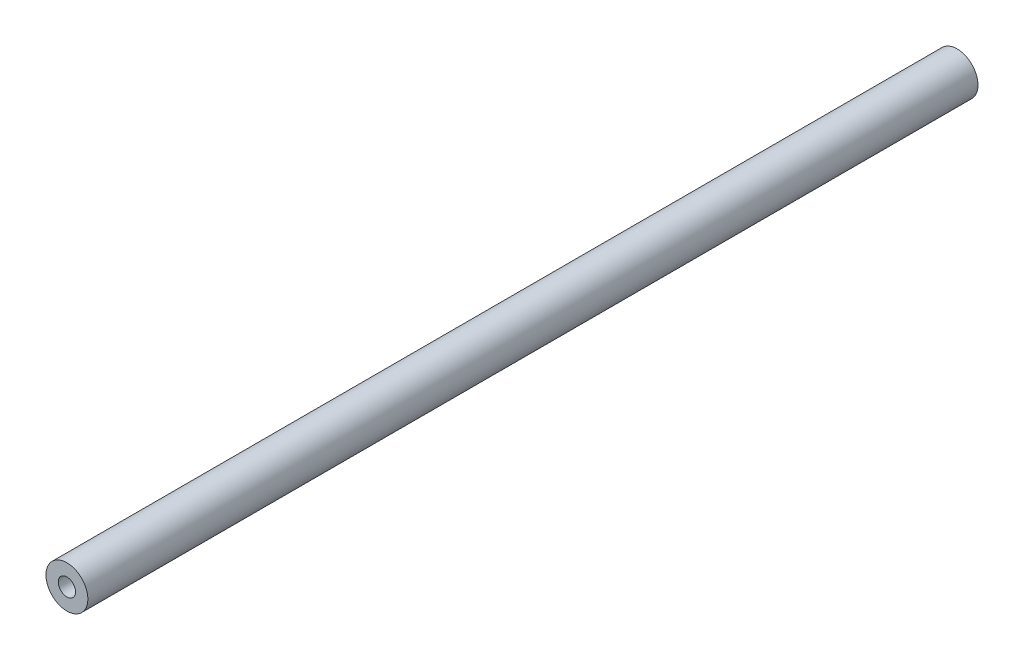
ISO-10303-21;
HEADER;
FILE_DESCRIPTION(('STEP AP214'),'2;1');
FILE_NAME('part.step','',(''),(''),'','','');
FILE_SCHEMA(('AUTOMOTIVE_DESIGN { 1 0 10303 214 1 1 1 1 }'));
ENDSEC;
DATA;
#1=APPLICATION_CONTEXT('core data for automotive mechanical design processes');
#2=APPLICATION_PROTOCOL_DEFINITION('international standard','automotive_design',2000,#1);
#3=PRODUCT_CONTEXT('',#1,'mechanical');
#4=PRODUCT('Part','Part','',(#3));
#5=PRODUCT_RELATED_PRODUCT_CATEGORY('part','',(#4));
#6=PRODUCT_DEFINITION_FORMATION('','',#4);
#7=PRODUCT_DEFINITION_CONTEXT('part definition',#1,'design');
#8=PRODUCT_DEFINITION('design','',#6,#7);
#9=PRODUCT_DEFINITION_SHAPE('','',#8);
#10=(LENGTH_UNIT() NAMED_UNIT(*) SI_UNIT(.MILLI.,.METRE.));
#11=(NAMED_UNIT(*) PLANE_ANGLE_UNIT() SI_UNIT($,.RADIAN.));
#12=(NAMED_UNIT(*) SI_UNIT($,.STERADIAN.) SOLID_ANGLE_UNIT());
#13=UNCERTAINTY_MEASURE_WITH_UNIT(LENGTH_MEASURE(1.E-05),#10,'distance_accuracy_value','');
#14=(GEOMETRIC_REPRESENTATION_CONTEXT(3) GLOBAL_UNCERTAINTY_ASSIGNED_CONTEXT((#13)) GLOBAL_UNIT_ASSIGNED_CONTEXT((#10,
#11,#12)) REPRESENTATION_CONTEXT('',''));
#15=CARTESIAN_POINT('',(0.,0.,0.));
#16=DIRECTION('',(0.,0.,1.));
#17=DIRECTION('',(1.,0.,0.));
#18=AXIS2_PLACEMENT_3D('',#15,#16,#17);
#19=CARTESIAN_POINT('',(0.,0.,170.));
#20=DIRECTION('',(0.,0.,-1.));
#21=DIRECTION('',(-1.,0.,0.));
#22=AXIS2_PLACEMENT_3D('',#19,#20,#21);
#23=CYLINDRICAL_SURFACE('',#22,4.);
#24=CARTESIAN_POINT('',(0.,0.,170.));
#25=DIRECTION('',(0.,0.,1.));
#26=DIRECTION('',(1.,0.,0.));
#27=AXIS2_PLACEMENT_3D('',#24,#25,#26);
#28=CIRCLE('',#27,4.);
#29=CARTESIAN_POINT('',(4.,0.,170.));
#30=VERTEX_POINT('',#29);
#31=EDGE_CURVE('E11',#30,#30,#28,.T.);
#32=ORIENTED_EDGE('',*,*,#31,.F.);
#33=EDGE_LOOP('',(#32));
#34=FACE_BOUND('',#33,.T.);
#35=CARTESIAN_POINT('',(0.,0.,0.));
#36=DIRECTION('',(0.,0.,1.));
#37=DIRECTION('',(1.,0.,0.));
#38=AXIS2_PLACEMENT_3D('',#35,#36,#37);
#39=CIRCLE('',#38,4.);
#40=CARTESIAN_POINT('',(4.,0.,0.));
#41=VERTEX_POINT('',#40);
#42=EDGE_CURVE('E40',#41,#41,#39,.T.);
#43=ORIENTED_EDGE('',*,*,#42,.T.);
#44=EDGE_LOOP('',(#43));
#45=FACE_BOUND('',#44,.T.);
#46=ADVANCED_FACE('F37',(#34,#45),#23,.T.);
#47=CARTESIAN_POINT('',(0.,0.,170.));
#48=DIRECTION('',(0.,0.,1.));
#49=DIRECTION('',(1.,0.,0.));
#50=AXIS2_PLACEMENT_3D('',#47,#48,#49);
#51=PLANE('',#50);
#52=CARTESIAN_POINT('',(0.,0.,170.));
#53=DIRECTION('',(0.,0.,1.));
#54=DIRECTION('',(1.,0.,0.));
#55=AXIS2_PLACEMENT_3D('',#52,#53,#54);
#56=CIRCLE('',#55,1.65);
#57=CARTESIAN_POINT('',(1.65,0.,170.));
#58=VERTEX_POINT('',#57);
#59=EDGE_CURVE('E60',#58,#58,#56,.T.);
#60=ORIENTED_EDGE('',*,*,#59,.F.);
#61=EDGE_LOOP('',(#60));
#62=FACE_BOUND('',#61,.T.);
#63=ORIENTED_EDGE('',*,*,#31,.T.);
#64=EDGE_LOOP('',(#63));
#65=FACE_BOUND('',#64,.T.);
#66=ADVANCED_FACE('F79',(#62,#65),#51,.T.);
#67=CARTESIAN_POINT('',(0.,0.,0.));
#68=DIRECTION('',(0.,0.,1.));
#69=DIRECTION('',(1.,0.,0.));
#70=AXIS2_PLACEMENT_3D('',#67,#68,#69);
#71=PLANE('',#70);
#72=CARTESIAN_POINT('',(0.,0.,0.));
#73=DIRECTION('',(0.,0.,-1.));
#74=DIRECTION('',(-1.,0.,0.));
#75=AXIS2_PLACEMENT_3D('',#72,#73,#74);
#76=CIRCLE('',#75,1.65);
#77=CARTESIAN_POINT('',(-1.65,0.,0.));
#78=VERTEX_POINT('',#77);
#79=EDGE_CURVE('E61',#78,#78,#76,.T.);
#80=ORIENTED_EDGE('',*,*,#79,.F.);
#81=EDGE_LOOP('',(#80));
#82=FACE_BOUND('',#81,.T.);
#83=ORIENTED_EDGE('',*,*,#42,.F.);
#84=EDGE_LOOP('',(#83));
#85=FACE_BOUND('',#84,.T.);
#86=ADVANCED_FACE('F76',(#82,#85),#71,.F.);
#87=CARTESIAN_POINT('',(0.,0.,154.5));
#88=DIRECTION('',(0.,0.,1.));
#89=DIRECTION('',(1.,0.,0.));
#90=AXIS2_PLACEMENT_3D('',#87,#88,#89);
#91=CONICAL_SURFACE('',#90,1.65,1.02974425867665);
#92=CARTESIAN_POINT('',(0.,0.,153.508579978605));
#93=VERTEX_POINT('',#92);
#94=VERTEX_LOOP('',#93);
#95=FACE_BOUND('',#94,.T.);
#96=CARTESIAN_POINT('',(0.,0.,154.5));
#97=DIRECTION('',(0.,0.,1.));
#98=DIRECTION('',(1.,0.,0.));
#99=AXIS2_PLACEMENT_3D('',#96,#97,#98);
#100=CIRCLE('',#99,1.65);
#101=CARTESIAN_POINT('',(1.65,0.,154.5));
#102=VERTEX_POINT('',#101);
#103=EDGE_CURVE('E64',#102,#102,#100,.T.);
#104=ORIENTED_EDGE('',*,*,#103,.T.);
#105=EDGE_LOOP('',(#104));
#106=FACE_BOUND('',#105,.T.);
#107=ADVANCED_FACE('F78',(#95,#106),#91,.F.);
#108=CARTESIAN_POINT('',(0.,0.,170.));
#109=DIRECTION('',(0.,0.,1.));
#110=DIRECTION('',(1.,0.,0.));
#111=AXIS2_PLACEMENT_3D('',#108,#109,#110);
#112=CYLINDRICAL_SURFACE('',#111,1.65);
#113=ORIENTED_EDGE('',*,*,#103,.F.);
#114=EDGE_LOOP('',(#113));
#115=FACE_BOUND('',#114,.T.);
#116=ORIENTED_EDGE('',*,*,#59,.T.);
#117=EDGE_LOOP('',(#116));
#118=FACE_BOUND('',#117,.T.);
#119=ADVANCED_FACE('F54',(#115,#118),#112,.F.);
#120=CARTESIAN_POINT('',(0.,0.,15.5));
#121=DIRECTION('',(0.,0.,-1.));
#122=DIRECTION('',(-1.,0.,0.));
#123=AXIS2_PLACEMENT_3D('',#120,#121,#122);
#124=CONICAL_SURFACE('',#123,1.65,1.02974425867665);
#125=CARTESIAN_POINT('',(0.,0.,16.4914200213955));
#126=VERTEX_POINT('',#125);
#127=VERTEX_LOOP('',#126);
#128=FACE_BOUND('',#127,.T.);
#129=CARTESIAN_POINT('',(0.,0.,15.5));
#130=DIRECTION('',(0.,0.,-1.));
#131=DIRECTION('',(-1.,0.,0.));
#132=AXIS2_PLACEMENT_3D('',#129,#130,#131);
#133=CIRCLE('',#132,1.65);
#134=CARTESIAN_POINT('',(-1.65,0.,15.5));
#135=VERTEX_POINT('',#134);
#136=EDGE_CURVE('E58',#135,#135,#133,.T.);
#137=ORIENTED_EDGE('',*,*,#136,.T.);
#138=EDGE_LOOP('',(#137));
#139=FACE_BOUND('',#138,.T.);
#140=ADVANCED_FACE('F50',(#128,#139),#124,.F.);
#141=CARTESIAN_POINT('',(0.,0.,0.));
#142=DIRECTION('',(0.,0.,-1.));
#143=DIRECTION('',(-1.,0.,0.));
#144=AXIS2_PLACEMENT_3D('',#141,#142,#143);
#145=CYLINDRICAL_SURFACE('',#144,1.65);
#146=ORIENTED_EDGE('',*,*,#136,.F.);
#147=EDGE_LOOP('',(#146));
#148=FACE_BOUND('',#147,.T.);
#149=ORIENTED_EDGE('',*,*,#79,.T.);
#150=EDGE_LOOP('',(#149));
#151=FACE_BOUND('',#150,.T.);
#152=ADVANCED_FACE('F53',(#148,#151),#145,.F.);
#153=CLOSED_SHELL('',(#46,#66,#86,#107,#119,#140,#152));
#154=MANIFOLD_SOLID_BREP('B2',#153);
#155=ADVANCED_BREP_SHAPE_REPRESENTATION('',(#18,#154),#14);
#156=SHAPE_DEFINITION_REPRESENTATION(#9,#155);
ENDSEC;
END-ISO-10303-21;
